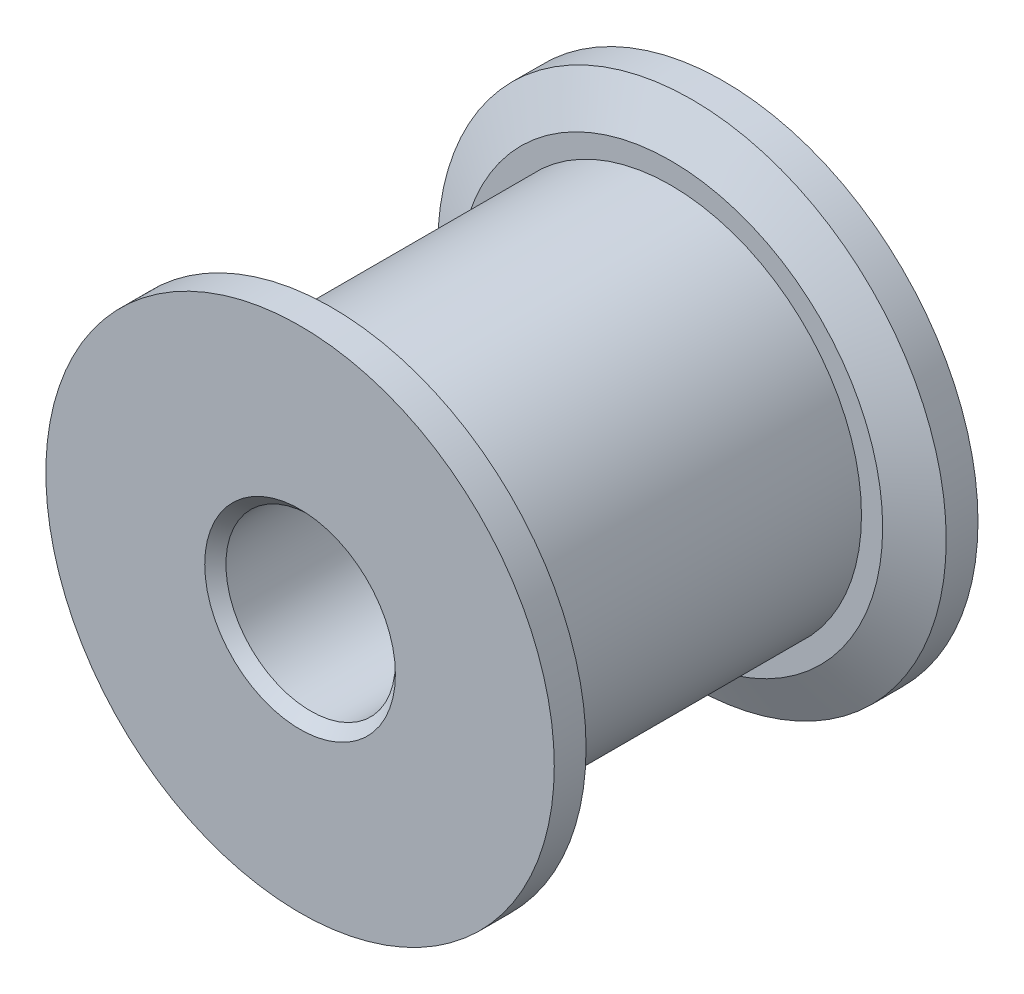
ISO-10303-21;
HEADER;
FILE_DESCRIPTION(('STEP AP214'),'2;1');
FILE_NAME('part.step','',(''),(''),'','','');
FILE_SCHEMA(('AUTOMOTIVE_DESIGN { 1 0 10303 214 1 1 1 1 }'));
ENDSEC;
DATA;
#1=APPLICATION_CONTEXT('core data for automotive mechanical design processes');
#2=APPLICATION_PROTOCOL_DEFINITION('international standard','automotive_design',2000,#1);
#3=PRODUCT_CONTEXT('',#1,'mechanical');
#4=PRODUCT('Part','Part','',(#3));
#5=PRODUCT_RELATED_PRODUCT_CATEGORY('part','',(#4));
#6=PRODUCT_DEFINITION_FORMATION('','',#4);
#7=PRODUCT_DEFINITION_CONTEXT('part definition',#1,'design');
#8=PRODUCT_DEFINITION('design','',#6,#7);
#9=PRODUCT_DEFINITION_SHAPE('','',#8);
#10=(LENGTH_UNIT() NAMED_UNIT(*) SI_UNIT(.MILLI.,.METRE.));
#11=(NAMED_UNIT(*) PLANE_ANGLE_UNIT() SI_UNIT($,.RADIAN.));
#12=(NAMED_UNIT(*) SI_UNIT($,.STERADIAN.) SOLID_ANGLE_UNIT());
#13=UNCERTAINTY_MEASURE_WITH_UNIT(LENGTH_MEASURE(1.E-05),#10,'distance_accuracy_value','');
#14=(GEOMETRIC_REPRESENTATION_CONTEXT(3) GLOBAL_UNCERTAINTY_ASSIGNED_CONTEXT((#13)) GLOBAL_UNIT_ASSIGNED_CONTEXT((#10,
#11,#12)) REPRESENTATION_CONTEXT('',''));
#15=CARTESIAN_POINT('',(0.,0.,0.));
#16=DIRECTION('',(0.,0.,1.));
#17=DIRECTION('',(1.,0.,0.));
#18=AXIS2_PLACEMENT_3D('',#15,#16,#17);
#19=CARTESIAN_POINT('',(0.,0.,15.));
#20=DIRECTION('',(0.,0.,-1.));
#21=DIRECTION('',(-1.,0.,0.));
#22=AXIS2_PLACEMENT_3D('',#19,#20,#21);
#23=CYLINDRICAL_SURFACE('',#22,18.);
#24=CARTESIAN_POINT('',(0.,0.,15.));
#25=DIRECTION('',(0.,0.,1.));
#26=DIRECTION('',(1.,0.,0.));
#27=AXIS2_PLACEMENT_3D('',#24,#25,#26);
#28=CIRCLE('',#27,18.);
#29=CARTESIAN_POINT('',(18.,0.,15.));
#30=VERTEX_POINT('',#29);
#31=EDGE_CURVE('E68',#30,#30,#28,.T.);
#32=ORIENTED_EDGE('',*,*,#31,.F.);
#33=EDGE_LOOP('',(#32));
#34=FACE_BOUND('',#33,.T.);
#35=CARTESIAN_POINT('',(0.,0.,-15.));
#36=DIRECTION('',(0.,0.,1.));
#37=DIRECTION('',(1.,0.,0.));
#38=AXIS2_PLACEMENT_3D('',#35,#36,#37);
#39=CIRCLE('',#38,18.);
#40=CARTESIAN_POINT('',(18.,0.,-15.));
#41=VERTEX_POINT('',#40);
#42=EDGE_CURVE('E69',#41,#41,#39,.T.);
#43=ORIENTED_EDGE('',*,*,#42,.T.);
#44=EDGE_LOOP('',(#43));
#45=FACE_BOUND('',#44,.T.);
#46=ADVANCED_FACE('F36',(#34,#45),#23,.T.);
#47=CARTESIAN_POINT('',(0.,0.,20.));
#48=DIRECTION('',(0.,0.,-1.));
#49=DIRECTION('',(-1.,0.,0.));
#50=AXIS2_PLACEMENT_3D('',#47,#48,#49);
#51=CYLINDRICAL_SURFACE('',#50,24.);
#52=CARTESIAN_POINT('',(0.,0.,17.));
#53=DIRECTION('',(0.,0.,1.));
#54=DIRECTION('',(1.,0.,0.));
#55=AXIS2_PLACEMENT_3D('',#52,#53,#54);
#56=CIRCLE('',#55,24.);
#57=CARTESIAN_POINT('',(24.,0.,17.));
#58=VERTEX_POINT('',#57);
#59=EDGE_CURVE('E65',#58,#58,#56,.T.);
#60=ORIENTED_EDGE('',*,*,#59,.T.);
#61=EDGE_LOOP('',(#60));
#62=FACE_BOUND('',#61,.T.);
#63=CARTESIAN_POINT('',(0.,0.,20.));
#64=DIRECTION('',(0.,0.,1.));
#65=DIRECTION('',(1.,0.,0.));
#66=AXIS2_PLACEMENT_3D('',#63,#64,#65);
#67=CIRCLE('',#66,24.);
#68=CARTESIAN_POINT('',(24.,0.,20.));
#69=VERTEX_POINT('',#68);
#70=EDGE_CURVE('E72',#69,#69,#67,.T.);
#71=ORIENTED_EDGE('',*,*,#70,.F.);
#72=EDGE_LOOP('',(#71));
#73=FACE_BOUND('',#72,.T.);
#74=ADVANCED_FACE('F99',(#62,#73),#51,.T.);
#75=CARTESIAN_POINT('',(0.,0.,20.));
#76=DIRECTION('',(0.,0.,1.));
#77=DIRECTION('',(1.,0.,0.));
#78=AXIS2_PLACEMENT_3D('',#75,#76,#77);
#79=PLANE('',#78);
#80=CARTESIAN_POINT('',(0.,0.,20.));
#81=DIRECTION('',(0.,0.,1.));
#82=DIRECTION('',(1.,0.,0.));
#83=AXIS2_PLACEMENT_3D('',#80,#81,#82);
#84=CIRCLE('',#83,9.);
#85=CARTESIAN_POINT('',(9.,0.,20.));
#86=VERTEX_POINT('',#85);
#87=EDGE_CURVE('E43',#86,#86,#84,.F.);
#88=ORIENTED_EDGE('',*,*,#87,.T.);
#89=EDGE_LOOP('',(#88));
#90=FACE_BOUND('',#89,.T.);
#91=ORIENTED_EDGE('',*,*,#70,.T.);
#92=EDGE_LOOP('',(#91));
#93=FACE_BOUND('',#92,.T.);
#94=ADVANCED_FACE('F105',(#90,#93),#79,.T.);
#95=CARTESIAN_POINT('',(0.,0.,15.));
#96=DIRECTION('',(0.,0.,1.));
#97=DIRECTION('',(1.,0.,0.));
#98=AXIS2_PLACEMENT_3D('',#95,#96,#97);
#99=PLANE('',#98);
#100=CARTESIAN_POINT('',(0.,0.,15.));
#101=DIRECTION('',(0.,0.,1.));
#102=DIRECTION('',(1.,0.,0.));
#103=AXIS2_PLACEMENT_3D('',#100,#101,#102);
#104=CIRCLE('',#103,20.);
#105=CARTESIAN_POINT('',(20.,0.,15.));
#106=VERTEX_POINT('',#105);
#107=EDGE_CURVE('E62',#106,#106,#104,.F.);
#108=ORIENTED_EDGE('',*,*,#107,.T.);
#109=EDGE_LOOP('',(#108));
#110=FACE_BOUND('',#109,.T.);
#111=ORIENTED_EDGE('',*,*,#31,.T.);
#112=EDGE_LOOP('',(#111));
#113=FACE_BOUND('',#112,.T.);
#114=ADVANCED_FACE('F114',(#110,#113),#99,.F.);
#115=CARTESIAN_POINT('',(0.,0.,17.));
#116=DIRECTION('',(0.,0.,1.));
#117=DIRECTION('',(1.,0.,0.));
#118=AXIS2_PLACEMENT_3D('',#115,#116,#117);
#119=CONICAL_SURFACE('',#118,24.,1.10714871779409);
#120=ORIENTED_EDGE('',*,*,#107,.F.);
#121=EDGE_LOOP('',(#120));
#122=FACE_BOUND('',#121,.T.);
#123=ORIENTED_EDGE('',*,*,#59,.F.);
#124=EDGE_LOOP('',(#123));
#125=FACE_BOUND('',#124,.T.);
#126=ADVANCED_FACE('F94',(#122,#125),#119,.T.);
#127=CARTESIAN_POINT('',(0.,0.,-20.));
#128=DIRECTION('',(0.,0.,1.));
#129=DIRECTION('',(1.,0.,0.));
#130=AXIS2_PLACEMENT_3D('',#127,#128,#129);
#131=CYLINDRICAL_SURFACE('',#130,24.);
#132=CARTESIAN_POINT('',(0.,0.,-17.));
#133=DIRECTION('',(0.,0.,-1.));
#134=DIRECTION('',(-1.,0.,0.));
#135=AXIS2_PLACEMENT_3D('',#132,#133,#134);
#136=CIRCLE('',#135,24.);
#137=CARTESIAN_POINT('',(-24.,0.,-17.));
#138=VERTEX_POINT('',#137);
#139=EDGE_CURVE('E56',#138,#138,#136,.T.);
#140=ORIENTED_EDGE('',*,*,#139,.T.);
#141=EDGE_LOOP('',(#140));
#142=FACE_BOUND('',#141,.T.);
#143=CARTESIAN_POINT('',(0.,0.,-20.));
#144=DIRECTION('',(0.,0.,1.));
#145=DIRECTION('',(1.,0.,0.));
#146=AXIS2_PLACEMENT_3D('',#143,#144,#145);
#147=CIRCLE('',#146,24.);
#148=CARTESIAN_POINT('',(24.,0.,-20.));
#149=VERTEX_POINT('',#148);
#150=EDGE_CURVE('E73',#149,#149,#147,.T.);
#151=ORIENTED_EDGE('',*,*,#150,.T.);
#152=EDGE_LOOP('',(#151));
#153=FACE_BOUND('',#152,.T.);
#154=ADVANCED_FACE('F81',(#142,#153),#131,.T.);
#155=CARTESIAN_POINT('',(0.,0.,-20.));
#156=DIRECTION('',(0.,0.,-1.));
#157=DIRECTION('',(1.,0.,0.));
#158=AXIS2_PLACEMENT_3D('',#155,#156,#157);
#159=PLANE('',#158);
#160=CARTESIAN_POINT('',(0.,0.,-20.));
#161=DIRECTION('',(0.,0.,-1.));
#162=DIRECTION('',(-1.,0.,0.));
#163=AXIS2_PLACEMENT_3D('',#160,#161,#162);
#164=CIRCLE('',#163,9.00000000000001);
#165=CARTESIAN_POINT('',(-9.00000000000001,0.,-20.));
#166=VERTEX_POINT('',#165);
#167=EDGE_CURVE('E10',#166,#166,#164,.F.);
#168=ORIENTED_EDGE('',*,*,#167,.T.);
#169=EDGE_LOOP('',(#168));
#170=FACE_BOUND('',#169,.T.);
#171=ORIENTED_EDGE('',*,*,#150,.F.);
#172=EDGE_LOOP('',(#171));
#173=FACE_BOUND('',#172,.T.);
#174=ADVANCED_FACE('F83',(#170,#173),#159,.T.);
#175=CARTESIAN_POINT('',(0.,0.,-15.));
#176=DIRECTION('',(0.,0.,-1.));
#177=DIRECTION('',(1.,0.,0.));
#178=AXIS2_PLACEMENT_3D('',#175,#176,#177);
#179=PLANE('',#178);
#180=CARTESIAN_POINT('',(0.,0.,-15.));
#181=DIRECTION('',(0.,0.,-1.));
#182=DIRECTION('',(-1.,0.,0.));
#183=AXIS2_PLACEMENT_3D('',#180,#181,#182);
#184=CIRCLE('',#183,20.);
#185=CARTESIAN_POINT('',(-20.,0.,-15.));
#186=VERTEX_POINT('',#185);
#187=EDGE_CURVE('E59',#186,#186,#184,.F.);
#188=ORIENTED_EDGE('',*,*,#187,.T.);
#189=EDGE_LOOP('',(#188));
#190=FACE_BOUND('',#189,.T.);
#191=ORIENTED_EDGE('',*,*,#42,.F.);
#192=EDGE_LOOP('',(#191));
#193=FACE_BOUND('',#192,.T.);
#194=ADVANCED_FACE('F85',(#190,#193),#179,.F.);
#195=CARTESIAN_POINT('',(0.,0.,-15.));
#196=DIRECTION('',(0.,0.,-1.));
#197=DIRECTION('',(-1.,0.,0.));
#198=AXIS2_PLACEMENT_3D('',#195,#196,#197);
#199=CONICAL_SURFACE('',#198,20.,1.10714871779409);
#200=ORIENTED_EDGE('',*,*,#139,.F.);
#201=EDGE_LOOP('',(#200));
#202=FACE_BOUND('',#201,.T.);
#203=ORIENTED_EDGE('',*,*,#187,.F.);
#204=EDGE_LOOP('',(#203));
#205=FACE_BOUND('',#204,.T.);
#206=ADVANCED_FACE('F91',(#202,#205),#199,.T.);
#207=CARTESIAN_POINT('',(0.,0.,-20.));
#208=DIRECTION('',(0.,0.,1.));
#209=DIRECTION('',(1.,0.,0.));
#210=AXIS2_PLACEMENT_3D('',#207,#208,#209);
#211=CYLINDRICAL_SURFACE('',#210,8.);
#212=CARTESIAN_POINT('',(0.,0.,19.));
#213=DIRECTION('',(0.,0.,1.));
#214=DIRECTION('',(1.,0.,0.));
#215=AXIS2_PLACEMENT_3D('',#212,#213,#214);
#216=CIRCLE('',#215,8.);
#217=CARTESIAN_POINT('',(8.,0.,19.));
#218=VERTEX_POINT('',#217);
#219=EDGE_CURVE('E47',#218,#218,#216,.T.);
#220=ORIENTED_EDGE('',*,*,#219,.T.);
#221=EDGE_LOOP('',(#220));
#222=FACE_BOUND('',#221,.T.);
#223=CARTESIAN_POINT('',(0.,0.,-19.));
#224=DIRECTION('',(0.,0.,-1.));
#225=DIRECTION('',(-1.,0.,0.));
#226=AXIS2_PLACEMENT_3D('',#223,#224,#225);
#227=CIRCLE('',#226,8.);
#228=CARTESIAN_POINT('',(-8.,0.,-19.));
#229=VERTEX_POINT('',#228);
#230=EDGE_CURVE('E51',#229,#229,#227,.T.);
#231=ORIENTED_EDGE('',*,*,#230,.T.);
#232=EDGE_LOOP('',(#231));
#233=FACE_BOUND('',#232,.T.);
#234=ADVANCED_FACE('F117',(#222,#233),#211,.F.);
#235=CARTESIAN_POINT('',(0.,0.,19.));
#236=DIRECTION('',(0.,0.,1.));
#237=DIRECTION('',(1.,0.,0.));
#238=AXIS2_PLACEMENT_3D('',#235,#236,#237);
#239=CONICAL_SURFACE('',#238,8.,0.785398163397452);
#240=ORIENTED_EDGE('',*,*,#87,.F.);
#241=EDGE_LOOP('',(#240));
#242=FACE_BOUND('',#241,.T.);
#243=ORIENTED_EDGE('',*,*,#219,.F.);
#244=EDGE_LOOP('',(#243));
#245=FACE_BOUND('',#244,.T.);
#246=ADVANCED_FACE('F119',(#242,#245),#239,.F.);
#247=CARTESIAN_POINT('',(0.,0.,-20.));
#248=DIRECTION('',(0.,0.,-1.));
#249=DIRECTION('',(-1.,0.,0.));
#250=AXIS2_PLACEMENT_3D('',#247,#248,#249);
#251=CONICAL_SURFACE('',#250,9.00000000000001,0.785398163397441);
#252=ORIENTED_EDGE('',*,*,#230,.F.);
#253=EDGE_LOOP('',(#252));
#254=FACE_BOUND('',#253,.T.);
#255=ORIENTED_EDGE('',*,*,#167,.F.);
#256=EDGE_LOOP('',(#255));
#257=FACE_BOUND('',#256,.T.);
#258=ADVANCED_FACE('F38',(#254,#257),#251,.F.);
#259=CLOSED_SHELL('',(#46,#74,#94,#114,#126,#154,#174,#194,#206,#234,#246,#258));
#260=MANIFOLD_SOLID_BREP('B2',#259);
#261=ADVANCED_BREP_SHAPE_REPRESENTATION('',(#18,#260),#14);
#262=SHAPE_DEFINITION_REPRESENTATION(#9,#261);
ENDSEC;
END-ISO-10303-21;
